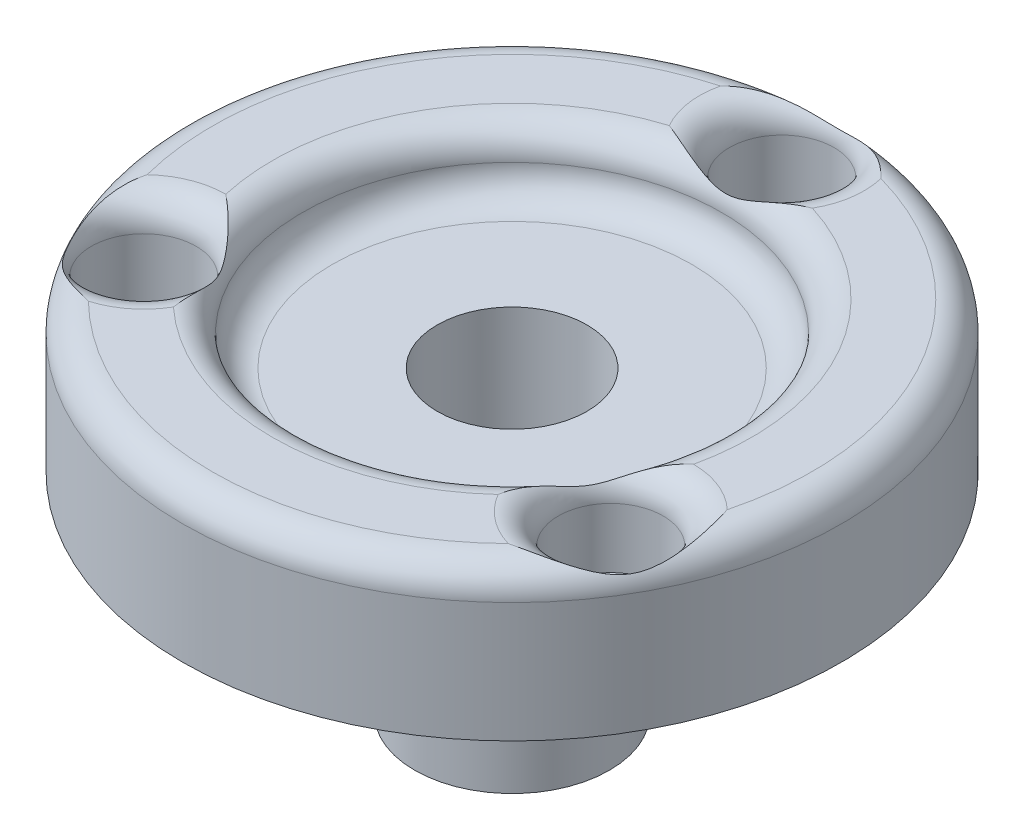
ISO-10303-21;
HEADER;
FILE_DESCRIPTION(('STEP AP214'),'2;1');
FILE_NAME('part.step','',(''),(''),'','','');
FILE_SCHEMA(('AUTOMOTIVE_DESIGN { 1 0 10303 214 1 1 1 1 }'));
ENDSEC;
DATA;
#1=APPLICATION_CONTEXT('core data for automotive mechanical design processes');
#2=APPLICATION_PROTOCOL_DEFINITION('international standard','automotive_design',2000,#1);
#3=PRODUCT_CONTEXT('',#1,'mechanical');
#4=PRODUCT('Part','Part','',(#3));
#5=PRODUCT_RELATED_PRODUCT_CATEGORY('part','',(#4));
#6=PRODUCT_DEFINITION_FORMATION('','',#4);
#7=PRODUCT_DEFINITION_CONTEXT('part definition',#1,'design');
#8=PRODUCT_DEFINITION('design','',#6,#7);
#9=PRODUCT_DEFINITION_SHAPE('','',#8);
#10=(LENGTH_UNIT() NAMED_UNIT(*) SI_UNIT(.MILLI.,.METRE.));
#11=(NAMED_UNIT(*) PLANE_ANGLE_UNIT() SI_UNIT($,.RADIAN.));
#12=(NAMED_UNIT(*) SI_UNIT($,.STERADIAN.) SOLID_ANGLE_UNIT());
#13=UNCERTAINTY_MEASURE_WITH_UNIT(LENGTH_MEASURE(1.E-05),#10,'distance_accuracy_value','');
#14=(GEOMETRIC_REPRESENTATION_CONTEXT(3) GLOBAL_UNCERTAINTY_ASSIGNED_CONTEXT((#13)) GLOBAL_UNIT_ASSIGNED_CONTEXT((#10,
#11,#12)) REPRESENTATION_CONTEXT('',''));
#15=CARTESIAN_POINT('',(0.,0.,0.));
#16=DIRECTION('',(0.,0.,1.));
#17=DIRECTION('',(1.,0.,0.));
#18=AXIS2_PLACEMENT_3D('',#15,#16,#17);
#19=CARTESIAN_POINT('',(0.,5.,0.));
#20=DIRECTION('',(0.,1.,0.));
#21=DIRECTION('',(0.,0.,1.));
#22=AXIS2_PLACEMENT_3D('',#19,#20,#21);
#23=PLANE('',#22);
#24=CARTESIAN_POINT('',(0.,5.,-9.));
#25=DIRECTION('',(0.,1.,0.));
#26=DIRECTION('',(0.,0.,1.));
#27=AXIS2_PLACEMENT_3D('',#24,#25,#26);
#28=CIRCLE('',#27,2.75);
#29=CARTESIAN_POINT('',(-2.38755362796082,5.,-7.63541666666667));
#30=VERTEX_POINT('',#29);
#31=CARTESIAN_POINT('',(-2.67558323730028,5.,-9.63541666666666));
#32=VERTEX_POINT('',#31);
#33=EDGE_CURVE('E53',#30,#32,#28,.F.);
#34=ORIENTED_EDGE('',*,*,#33,.T.);
#35=CARTESIAN_POINT('',(0.,5.,0.));
#36=DIRECTION('',(0.,1.,0.));
#37=DIRECTION('',(0.,0.,1.));
#38=AXIS2_PLACEMENT_3D('',#35,#36,#37);
#39=CIRCLE('',#38,10.);
#40=CARTESIAN_POINT('',(-9.68230722803127,5.,2.50058527989216));
#41=VERTEX_POINT('',#40);
#42=EDGE_CURVE('E141',#32,#41,#39,.T.);
#43=ORIENTED_EDGE('',*,*,#42,.T.);
#44=CARTESIAN_POINT('',(-7.7942286340594,5.,4.50000000000032));
#45=DIRECTION('',(0.,1.,0.));
#46=DIRECTION('',(0.,0.,1.));
#47=AXIS2_PLACEMENT_3D('',#44,#45,#46);
#48=CIRCLE('',#47,2.75);
#49=CARTESIAN_POINT('',(-7.80624161579277,5.,1.75002623862188));
#50=VERTEX_POINT('',#49);
#51=EDGE_CURVE('E61',#41,#50,#48,.F.);
#52=ORIENTED_EDGE('',*,*,#51,.T.);
#53=CARTESIAN_POINT('',(0.,5.,0.));
#54=DIRECTION('',(0.,1.,0.));
#55=DIRECTION('',(0.,0.,1.));
#56=AXIS2_PLACEMENT_3D('',#53,#54,#55);
#57=CIRCLE('',#56,8.);
#58=EDGE_CURVE('E137',#50,#30,#57,.F.);
#59=ORIENTED_EDGE('',*,*,#58,.T.);
#60=EDGE_LOOP('',(#34,#43,#52,#59));
#61=FACE_BOUND('',#60,.T.);
#62=ADVANCED_FACE('F32',(#61),#23,.T.);
#63=CARTESIAN_POINT('',(7.79422863406049,5.,4.49999999999969));
#64=DIRECTION('',(0.,1.,0.));
#65=DIRECTION('',(0.,0.,1.));
#66=AXIS2_PLACEMENT_3D('',#63,#64,#65);
#67=CIRCLE('',#66,2.75);
#68=CARTESIAN_POINT('',(7.80624161579291,5.,1.75002623862124));
#69=VERTEX_POINT('',#68);
#70=CARTESIAN_POINT('',(9.68230722803162,5.,2.50058527989082));
#71=VERTEX_POINT('',#70);
#72=EDGE_CURVE('E109',#69,#71,#67,.F.);
#73=ORIENTED_EDGE('',*,*,#72,.T.);
#74=CARTESIAN_POINT('',(0.,5.,0.));
#75=DIRECTION('',(0.,1.,0.));
#76=DIRECTION('',(0.,0.,1.));
#77=AXIS2_PLACEMENT_3D('',#74,#75,#76);
#78=CIRCLE('',#77,10.);
#79=CARTESIAN_POINT('',(2.67558323730028,5.,-9.63541666666666));
#80=VERTEX_POINT('',#79);
#81=EDGE_CURVE('E134',#71,#80,#78,.T.);
#82=ORIENTED_EDGE('',*,*,#81,.T.);
#83=CARTESIAN_POINT('',(0.,5.,-9.));
#84=DIRECTION('',(0.,1.,0.));
#85=DIRECTION('',(0.,0.,1.));
#86=AXIS2_PLACEMENT_3D('',#83,#84,#85);
#87=CIRCLE('',#86,2.75);
#88=CARTESIAN_POINT('',(2.38755362796082,5.,-7.63541666666667));
#89=VERTEX_POINT('',#88);
#90=EDGE_CURVE('E132',#80,#89,#87,.F.);
#91=ORIENTED_EDGE('',*,*,#90,.T.);
#92=CARTESIAN_POINT('',(0.,5.,0.));
#93=DIRECTION('',(0.,1.,0.));
#94=DIRECTION('',(0.,0.,1.));
#95=AXIS2_PLACEMENT_3D('',#92,#93,#94);
#96=CIRCLE('',#95,8.);
#97=EDGE_CURVE('E129',#89,#69,#96,.F.);
#98=ORIENTED_EDGE('',*,*,#97,.T.);
#99=EDGE_LOOP('',(#73,#82,#91,#98));
#100=FACE_BOUND('',#99,.T.);
#101=ADVANCED_FACE('F209',(#100),#23,.T.);
#102=CARTESIAN_POINT('',(0.,5.,0.));
#103=DIRECTION('',(0.,-1.,0.));
#104=DIRECTION('',(0.,0.,-1.));
#105=AXIS2_PLACEMENT_3D('',#102,#103,#104);
#106=CYLINDRICAL_SURFACE('',#105,11.);
#107=CARTESIAN_POINT('',(0.,4.,0.));
#108=DIRECTION('',(0.,1.,0.));
#109=DIRECTION('',(0.,0.,1.));
#110=AXIS2_PLACEMENT_3D('',#107,#108,#109);
#111=CIRCLE('',#110,11.);
#112=CARTESIAN_POINT('',(0.,4.,11.));
#113=VERTEX_POINT('',#112);
#114=EDGE_CURVE('E143',#113,#113,#111,.F.);
#115=ORIENTED_EDGE('',*,*,#114,.T.);
#116=EDGE_LOOP('',(#115));
#117=FACE_BOUND('',#116,.T.);
#118=CARTESIAN_POINT('',(0.,0.,0.));
#119=DIRECTION('',(0.,1.,0.));
#120=DIRECTION('',(0.,0.,1.));
#121=AXIS2_PLACEMENT_3D('',#118,#119,#120);
#122=CIRCLE('',#121,11.);
#123=CARTESIAN_POINT('',(0.,0.,11.));
#124=VERTEX_POINT('',#123);
#125=EDGE_CURVE('E234',#124,#124,#122,.T.);
#126=ORIENTED_EDGE('',*,*,#125,.T.);
#127=EDGE_LOOP('',(#126));
#128=FACE_BOUND('',#127,.T.);
#129=ADVANCED_FACE('F214',(#117,#128),#106,.T.);
#130=CARTESIAN_POINT('',(-7.7942286340594,5.,4.50000000000032));
#131=DIRECTION('',(0.,1.,0.));
#132=DIRECTION('',(0.,0.,1.));
#133=AXIS2_PLACEMENT_3D('',#130,#131,#132);
#134=CIRCLE('',#133,2.75);
#135=CARTESIAN_POINT('',(-5.41868798783155,5.,5.88539042804554));
#136=VERTEX_POINT('',#135);
#137=CARTESIAN_POINT('',(-7.0067239907308,5.,7.13483138677554));
#138=VERTEX_POINT('',#137);
#139=EDGE_CURVE('E103',#136,#138,#134,.F.);
#140=ORIENTED_EDGE('',*,*,#139,.T.);
#141=CARTESIAN_POINT('',(0.,5.,0.));
#142=DIRECTION('',(0.,1.,0.));
#143=DIRECTION('',(0.,0.,1.));
#144=AXIS2_PLACEMENT_3D('',#141,#142,#143);
#145=CIRCLE('',#144,10.);
#146=CARTESIAN_POINT('',(7.00672399073154,5.,7.13483138677481));
#147=VERTEX_POINT('',#146);
#148=EDGE_CURVE('E99',#138,#147,#145,.T.);
#149=ORIENTED_EDGE('',*,*,#148,.T.);
#150=CARTESIAN_POINT('',(7.79422863406049,5.,4.49999999999969));
#151=DIRECTION('',(0.,1.,0.));
#152=DIRECTION('',(0.,0.,1.));
#153=AXIS2_PLACEMENT_3D('',#150,#151,#152);
#154=CIRCLE('',#153,2.75);
#155=CARTESIAN_POINT('',(5.41868798783249,5.,5.88539042804467));
#156=VERTEX_POINT('',#155);
#157=EDGE_CURVE('E92',#147,#156,#154,.F.);
#158=ORIENTED_EDGE('',*,*,#157,.T.);
#159=CARTESIAN_POINT('',(0.,5.,0.));
#160=DIRECTION('',(0.,1.,0.));
#161=DIRECTION('',(0.,0.,1.));
#162=AXIS2_PLACEMENT_3D('',#159,#160,#161);
#163=CIRCLE('',#162,8.);
#164=EDGE_CURVE('E96',#156,#136,#163,.F.);
#165=ORIENTED_EDGE('',*,*,#164,.T.);
#166=EDGE_LOOP('',(#140,#149,#158,#165));
#167=FACE_BOUND('',#166,.T.);
#168=ADVANCED_FACE('F94',(#167),#23,.T.);
#169=CARTESIAN_POINT('',(0.,0.,0.));
#170=DIRECTION('',(0.,1.,0.));
#171=DIRECTION('',(0.,0.,1.));
#172=AXIS2_PLACEMENT_3D('',#169,#170,#171);
#173=PLANE('',#172);
#174=CARTESIAN_POINT('',(0.,0.,0.));
#175=DIRECTION('',(0.,1.,0.));
#176=DIRECTION('',(0.,0.,1.));
#177=AXIS2_PLACEMENT_3D('',#174,#175,#176);
#178=CIRCLE('',#177,3.25);
#179=CARTESIAN_POINT('',(0.,0.,3.25));
#180=VERTEX_POINT('',#179);
#181=EDGE_CURVE('E124',#180,#180,#178,.F.);
#182=ORIENTED_EDGE('',*,*,#181,.F.);
#183=EDGE_LOOP('',(#182));
#184=FACE_BOUND('',#183,.T.);
#185=ORIENTED_EDGE('',*,*,#125,.F.);
#186=EDGE_LOOP('',(#185));
#187=FACE_BOUND('',#186,.T.);
#188=ADVANCED_FACE('F219',(#184,#187),#173,.F.);
#189=CARTESIAN_POINT('',(0.,2.,-9.));
#190=DIRECTION('',(0.,1.,0.));
#191=DIRECTION('',(0.,0.,1.));
#192=AXIS2_PLACEMENT_3D('',#189,#190,#191);
#193=CYLINDRICAL_SURFACE('',#192,1.75);
#194=CARTESIAN_POINT('',(0.,4.,-9.));
#195=DIRECTION('',(0.,1.,0.));
#196=DIRECTION('',(0.,0.,1.));
#197=AXIS2_PLACEMENT_3D('',#194,#195,#196);
#198=CIRCLE('',#197,1.75);
#199=CARTESIAN_POINT('',(0.,4.,-7.25));
#200=VERTEX_POINT('',#199);
#201=EDGE_CURVE('E146',#200,#200,#198,.T.);
#202=ORIENTED_EDGE('',*,*,#201,.T.);
#203=EDGE_LOOP('',(#202));
#204=FACE_BOUND('',#203,.T.);
#205=CARTESIAN_POINT('',(0.,2.,-9.));
#206=DIRECTION('',(0.,1.,0.));
#207=DIRECTION('',(0.,0.,1.));
#208=AXIS2_PLACEMENT_3D('',#205,#206,#207);
#209=CIRCLE('',#208,1.75);
#210=CARTESIAN_POINT('',(0.,2.,-7.25));
#211=VERTEX_POINT('',#210);
#212=EDGE_CURVE('E236',#211,#211,#209,.T.);
#213=ORIENTED_EDGE('',*,*,#212,.F.);
#214=EDGE_LOOP('',(#213));
#215=FACE_BOUND('',#214,.T.);
#216=ADVANCED_FACE('F224',(#204,#215),#193,.F.);
#217=CARTESIAN_POINT('',(0.,2.,-9.));
#218=DIRECTION('',(0.,1.,0.));
#219=DIRECTION('',(0.,0.,1.));
#220=AXIS2_PLACEMENT_3D('',#217,#218,#219);
#221=PLANE('',#220);
#222=ORIENTED_EDGE('',*,*,#212,.T.);
#223=EDGE_LOOP('',(#222));
#224=FACE_BOUND('',#223,.T.);
#225=ADVANCED_FACE('F296',(#224),#221,.T.);
#226=CARTESIAN_POINT('',(7.79422863406049,2.,4.49999999999969));
#227=DIRECTION('',(0.,1.,0.));
#228=DIRECTION('',(0.,0.,1.));
#229=AXIS2_PLACEMENT_3D('',#226,#227,#228);
#230=CYLINDRICAL_SURFACE('',#229,1.75);
#231=CARTESIAN_POINT('',(7.79422863406049,4.,4.49999999999969));
#232=DIRECTION('',(0.,1.,0.));
#233=DIRECTION('',(0.,0.,1.));
#234=AXIS2_PLACEMENT_3D('',#231,#232,#233);
#235=CIRCLE('',#234,1.75);
#236=CARTESIAN_POINT('',(7.79422863406049,4.,6.24999999999969));
#237=VERTEX_POINT('',#236);
#238=EDGE_CURVE('E45',#237,#237,#235,.T.);
#239=ORIENTED_EDGE('',*,*,#238,.T.);
#240=EDGE_LOOP('',(#239));
#241=FACE_BOUND('',#240,.T.);
#242=CARTESIAN_POINT('',(7.79422863406049,2.,4.49999999999969));
#243=DIRECTION('',(0.,1.,0.));
#244=DIRECTION('',(0.,0.,1.));
#245=AXIS2_PLACEMENT_3D('',#242,#243,#244);
#246=CIRCLE('',#245,1.75);
#247=CARTESIAN_POINT('',(7.79422863406049,2.,6.24999999999969));
#248=VERTEX_POINT('',#247);
#249=EDGE_CURVE('E240',#248,#248,#246,.T.);
#250=ORIENTED_EDGE('',*,*,#249,.F.);
#251=EDGE_LOOP('',(#250));
#252=FACE_BOUND('',#251,.T.);
#253=ADVANCED_FACE('F292',(#241,#252),#230,.F.);
#254=CARTESIAN_POINT('',(7.79422863406049,2.,4.49999999999969));
#255=DIRECTION('',(0.,1.,0.));
#256=DIRECTION('',(0.,0.,1.));
#257=AXIS2_PLACEMENT_3D('',#254,#255,#256);
#258=PLANE('',#257);
#259=ORIENTED_EDGE('',*,*,#249,.T.);
#260=EDGE_LOOP('',(#259));
#261=FACE_BOUND('',#260,.T.);
#262=ADVANCED_FACE('F275',(#261),#258,.T.);
#263=CARTESIAN_POINT('',(-7.7942286340594,2.,4.50000000000032));
#264=DIRECTION('',(0.,1.,0.));
#265=DIRECTION('',(0.,0.,1.));
#266=AXIS2_PLACEMENT_3D('',#263,#264,#265);
#267=CYLINDRICAL_SURFACE('',#266,1.75);
#268=CARTESIAN_POINT('',(-7.7942286340594,4.,4.50000000000032));
#269=DIRECTION('',(0.,1.,0.));
#270=DIRECTION('',(0.,0.,1.));
#271=AXIS2_PLACEMENT_3D('',#268,#269,#270);
#272=CIRCLE('',#271,1.75);
#273=CARTESIAN_POINT('',(-7.7942286340594,4.,6.25000000000032));
#274=VERTEX_POINT('',#273);
#275=EDGE_CURVE('E11',#274,#274,#272,.T.);
#276=ORIENTED_EDGE('',*,*,#275,.T.);
#277=EDGE_LOOP('',(#276));
#278=FACE_BOUND('',#277,.T.);
#279=CARTESIAN_POINT('',(-7.7942286340594,2.,4.50000000000032));
#280=DIRECTION('',(0.,1.,0.));
#281=DIRECTION('',(0.,0.,1.));
#282=AXIS2_PLACEMENT_3D('',#279,#280,#281);
#283=CIRCLE('',#282,1.75);
#284=CARTESIAN_POINT('',(-7.7942286340594,2.,6.25000000000032));
#285=VERTEX_POINT('',#284);
#286=EDGE_CURVE('E245',#285,#285,#283,.T.);
#287=ORIENTED_EDGE('',*,*,#286,.F.);
#288=EDGE_LOOP('',(#287));
#289=FACE_BOUND('',#288,.T.);
#290=ADVANCED_FACE('F271',(#278,#289),#267,.F.);
#291=CARTESIAN_POINT('',(-7.7942286340594,2.,4.50000000000032));
#292=DIRECTION('',(0.,1.,0.));
#293=DIRECTION('',(0.,0.,1.));
#294=AXIS2_PLACEMENT_3D('',#291,#292,#293);
#295=PLANE('',#294);
#296=ORIENTED_EDGE('',*,*,#286,.T.);
#297=EDGE_LOOP('',(#296));
#298=FACE_BOUND('',#297,.T.);
#299=ADVANCED_FACE('F274',(#298),#295,.T.);
#300=CARTESIAN_POINT('',(0.,3.,0.));
#301=DIRECTION('',(0.,1.,0.));
#302=DIRECTION('',(0.,0.,1.));
#303=AXIS2_PLACEMENT_3D('',#300,#301,#302);
#304=PLANE('',#303);
#305=CARTESIAN_POINT('',(0.,3.,0.));
#306=DIRECTION('',(0.,1.,0.));
#307=DIRECTION('',(0.,0.,1.));
#308=AXIS2_PLACEMENT_3D('',#305,#306,#307);
#309=CIRCLE('',#308,6.);
#310=CARTESIAN_POINT('',(0.,3.,6.));
#311=VERTEX_POINT('',#310);
#312=EDGE_CURVE('E120',#311,#311,#309,.T.);
#313=ORIENTED_EDGE('',*,*,#312,.T.);
#314=EDGE_LOOP('',(#313));
#315=FACE_BOUND('',#314,.T.);
#316=CARTESIAN_POINT('',(0.,3.,0.));
#317=DIRECTION('',(0.,1.,0.));
#318=DIRECTION('',(0.,0.,1.));
#319=AXIS2_PLACEMENT_3D('',#316,#317,#318);
#320=CIRCLE('',#319,2.5);
#321=CARTESIAN_POINT('',(0.,3.,2.5));
#322=VERTEX_POINT('',#321);
#323=EDGE_CURVE('E251',#322,#322,#320,.T.);
#324=ORIENTED_EDGE('',*,*,#323,.F.);
#325=EDGE_LOOP('',(#324));
#326=FACE_BOUND('',#325,.T.);
#327=ADVANCED_FACE('F280',(#315,#326),#304,.T.);
#328=CARTESIAN_POINT('',(0.,-7.,0.));
#329=DIRECTION('',(0.,1.,0.));
#330=DIRECTION('',(0.,0.,1.));
#331=AXIS2_PLACEMENT_3D('',#328,#329,#330);
#332=CYLINDRICAL_SURFACE('',#331,3.25);
#333=CARTESIAN_POINT('',(0.,-7.,0.));
#334=DIRECTION('',(0.,-1.,0.));
#335=DIRECTION('',(0.,0.,-1.));
#336=AXIS2_PLACEMENT_3D('',#333,#334,#335);
#337=CIRCLE('',#336,3.25);
#338=CARTESIAN_POINT('',(0.,-7.,-3.25));
#339=VERTEX_POINT('',#338);
#340=EDGE_CURVE('E248',#339,#339,#337,.T.);
#341=ORIENTED_EDGE('',*,*,#340,.F.);
#342=EDGE_LOOP('',(#341));
#343=FACE_BOUND('',#342,.T.);
#344=ORIENTED_EDGE('',*,*,#181,.T.);
#345=EDGE_LOOP('',(#344));
#346=FACE_BOUND('',#345,.T.);
#347=ADVANCED_FACE('F285',(#343,#346),#332,.T.);
#348=CARTESIAN_POINT('',(0.,-7.,0.));
#349=DIRECTION('',(0.,-1.,0.));
#350=DIRECTION('',(0.,0.,-1.));
#351=AXIS2_PLACEMENT_3D('',#348,#349,#350);
#352=PLANE('',#351);
#353=CARTESIAN_POINT('',(0.,-7.,0.));
#354=DIRECTION('',(0.,-1.,0.));
#355=DIRECTION('',(0.,0.,-1.));
#356=AXIS2_PLACEMENT_3D('',#353,#354,#355);
#357=CIRCLE('',#356,2.5);
#358=CARTESIAN_POINT('',(0.,-7.,-2.5));
#359=VERTEX_POINT('',#358);
#360=EDGE_CURVE('E254',#359,#359,#357,.T.);
#361=ORIENTED_EDGE('',*,*,#360,.F.);
#362=EDGE_LOOP('',(#361));
#363=FACE_BOUND('',#362,.T.);
#364=ORIENTED_EDGE('',*,*,#340,.T.);
#365=EDGE_LOOP('',(#364));
#366=FACE_BOUND('',#365,.T.);
#367=ADVANCED_FACE('F375',(#363,#366),#352,.T.);
#368=CARTESIAN_POINT('',(0.,8.00000000000001,0.));
#369=DIRECTION('',(0.,-1.,0.));
#370=DIRECTION('',(0.,0.,-1.));
#371=AXIS2_PLACEMENT_3D('',#368,#369,#370);
#372=CYLINDRICAL_SURFACE('',#371,2.5);
#373=ORIENTED_EDGE('',*,*,#323,.T.);
#374=EDGE_LOOP('',(#373));
#375=FACE_BOUND('',#374,.T.);
#376=ORIENTED_EDGE('',*,*,#360,.T.);
#377=EDGE_LOOP('',(#376));
#378=FACE_BOUND('',#377,.T.);
#379=ADVANCED_FACE('F198',(#375,#378),#372,.F.);
#380=CARTESIAN_POINT('',(0.,4.,0.));
#381=DIRECTION('',(0.,1.,0.));
#382=DIRECTION('',(0.,0.,1.));
#383=AXIS2_PLACEMENT_3D('',#380,#381,#382);
#384=TOROIDAL_SURFACE('',#383,10.,1.);
#385=ORIENTED_EDGE('',*,*,#114,.F.);
#386=EDGE_LOOP('',(#385));
#387=FACE_BOUND('',#386,.T.);
#388=CARTESIAN_POINT('',(9.68230722803162,5.,2.50058527989082));
#389=CARTESIAN_POINT('',(9.68293122787984,4.99999999289287,2.50275001462165));
#390=CARTESIAN_POINT('',(9.68355376892448,4.99999802492857,2.50491521072469));
#391=CARTESIAN_POINT('',(9.73072449026111,4.99970014995168,2.66939566220376));
#392=CARTESIAN_POINT('',(9.76906282956554,4.98842946601575,2.83427567242256));
#393=CARTESIAN_POINT('',(9.82691492459715,4.94961759514946,3.16564958110249));
#394=CARTESIAN_POINT('',(9.84637618519727,4.92203137699082,3.33214668701702));
#395=CARTESIAN_POINT('',(9.86086509575913,4.87022438303142,3.59198018961696));
#396=CARTESIAN_POINT('',(9.86282800378811,4.84973008915019,3.68573861128274));
#397=CARTESIAN_POINT('',(9.85998319877821,4.80624814568228,3.87256726988606));
#398=CARTESIAN_POINT('',(9.85517662806238,4.78326091737264,3.96563762026901));
#399=CARTESIAN_POINT('',(9.83855309177433,4.7359616859256,4.15096011536726));
#400=CARTESIAN_POINT('',(9.82672520332001,4.71164767237435,4.24321075744506));
#401=CARTESIAN_POINT('',(9.79578730916428,4.66326714790835,4.42654054580411));
#402=CARTESIAN_POINT('',(9.7766794564654,4.63920056597634,4.51762003022296));
#403=CARTESIAN_POINT('',(9.73785568135397,4.60045136777176,4.67080509067776));
#404=CARTESIAN_POINT('',(9.72011151517862,4.58514923887297,4.73325596661643));
#405=CARTESIAN_POINT('',(9.68081782794899,4.55665426519299,4.85745288522944));
#406=CARTESIAN_POINT('',(9.65926847535845,4.54346132708266,4.9191989589781));
#407=CARTESIAN_POINT('',(9.61240260496447,4.52039826493819,5.04142216705938));
#408=CARTESIAN_POINT('',(9.58711165760926,4.51050696504576,5.10190496058564));
#409=CARTESIAN_POINT('',(9.53264209619287,4.49508953132335,5.22166495320231));
#410=CARTESIAN_POINT('',(9.50346489818042,4.48956181257556,5.2809425823978));
#411=CARTESIAN_POINT('',(9.44103706289631,4.48365691539091,5.3983956537084));
#412=CARTESIAN_POINT('',(9.40774699431049,4.48333423991811,5.45655307082596));
#413=CARTESIAN_POINT('',(9.33768982707241,4.4880290601587,5.57050060971875));
#414=CARTESIAN_POINT('',(9.30092212605365,4.4930474825616,5.626290318946));
#415=CARTESIAN_POINT('',(9.18555912241717,4.51505927391676,5.79005170093081));
#416=CARTESIAN_POINT('',(9.10224604433231,4.53902925363097,5.89377621987413));
#417=CARTESIAN_POINT('',(8.94794224781334,4.58862424758896,6.06417769814614));
#418=CARTESIAN_POINT('',(8.87918028624801,4.61228999691721,6.13358137559057));
#419=CARTESIAN_POINT('',(8.73630228054981,4.66144298052247,6.26602776867833));
#420=CARTESIAN_POINT('',(8.66218403095377,4.68693096506204,6.32906783819004));
#421=CARTESIAN_POINT('',(8.50895450417988,4.73755067310296,6.44894722488114));
#422=CARTESIAN_POINT('',(8.42984166455751,4.76268228207918,6.50578458635926));
#423=CARTESIAN_POINT('',(8.26700105249125,4.81098564005148,6.61336904450495));
#424=CARTESIAN_POINT('',(8.18327220656441,4.83415692995976,6.66411471571679));
#425=CARTESIAN_POINT('',(7.92964914433914,4.89780722023445,6.80513020164878));
#426=CARTESIAN_POINT('',(7.75375661243947,4.93370903723956,6.88692122403518));
#427=CARTESIAN_POINT('',(7.39047441957718,4.98459180645575,7.02724829376745));
#428=CARTESIAN_POINT('',(7.20313219797398,4.99965368403904,7.08587366005666));
#429=CARTESIAN_POINT('',(7.01109708834323,4.99999802273882,7.13374596127582));
#430=CARTESIAN_POINT('',(7.00891070301672,4.99999999066669,7.13428942293817));
#431=CARTESIAN_POINT('',(7.00672399073154,5.,7.13483138677481));
#432=B_SPLINE_CURVE_WITH_KNOTS('',3,(#388,#389,#390,#391,#392,#393,#394,#395,#396,#397,#398,
#399,#400,#401,#402,#403,#404,#405,#406,#407,#408,#409,#410,#411,#412,#413,#414,#415,#416,#417,
#418,#419,#420,#421,#422,#423,#424,#425,#426,#427,#428,#429,#430,#431),.UNSPECIFIED.,.F.,.F.,(4,
2,2,2,2,2,2,2,2,2,2,2,2,2,2,2,2,2,2,2,2,4),(0.,0.00675874589591421,0.513324019385968,
1.02129399180734,1.30902593812217,1.596709336614,1.88484145390252,2.17288842403652,
2.37287491434796,2.57285255304894,2.77152177064788,2.97011879537665,3.17079403180504,
3.37150409140344,3.77506342056821,4.07633949291594,4.37774033101154,4.67923592727949,
4.98080193656975,5.57006390783273,6.15703118128854,6.16378992722158),.UNSPECIFIED.);
#433=EDGE_CURVE('E184',#147,#71,#432,.F.);
#434=ORIENTED_EDGE('',*,*,#433,.F.);
#435=ORIENTED_EDGE('',*,*,#148,.F.);
#436=CARTESIAN_POINT('',(-7.00672399073079,5.,7.13483138677555));
#437=CARTESIAN_POINT('',(-7.00891070592425,4.99999999289287,7.13428941913064));
#438=CARTESIAN_POINT('',(-7.01109709127598,4.99999802492857,7.13374595743867));
#439=CARTESIAN_POINT('',(-7.17712670135101,4.99970014995168,7.09235677469053));
#440=CARTESIAN_POINT('',(-7.33908614842924,4.98842946601574,7.04311874535829));
#441=CARTESIAN_POINT('',(-7.65499041901351,4.94961759514942,6.92753317497818));
#442=CARTESIAN_POINT('',(-7.80891177269214,4.92203137699076,6.86113856809003));
#443=CARTESIAN_POINT('',(-8.04117864197772,4.87022438303161,6.74376958141022));
#444=CARTESIAN_POINT('',(-8.12335727097236,4.84973008915071,6.69859029879639));
#445=CARTESIAN_POINT('',(-8.28373323297065,4.80624814568351,6.60271229608883));
#446=CARTESIAN_POINT('',(-8.36193123538245,4.78326091737425,6.55201450855318));
#447=CARTESIAN_POINT('',(-8.51411345588429,4.73596168592799,6.44495685627965));
#448=CARTESIAN_POINT('',(-8.58809091121104,4.71164767237713,6.38858828336713));
#449=CARTESIAN_POINT('',(-8.73139021812091,4.66326714791181,6.27013038691123));
#450=CARTESIAN_POINT('',(-8.80071343904105,4.63920056598012,6.20804275885393));
#451=CARTESIAN_POINT('',(-8.91396370531919,4.6004513677756,6.09782785311041));
#452=CARTESIAN_POINT('',(-8.95917566728339,4.58514923887664,6.05123551646423));
#453=CARTESIAN_POINT('',(-9.04708651026,4.55665426519625,5.95510772580843));
#454=CARTESIAN_POINT('',(-9.08978550241541,4.5434613270857,5.90557240215554));
#455=CARTESIAN_POINT('',(-9.1722009703496,4.52039826494071,5.80387376378312));
#456=CARTESIAN_POINT('',(-9.21193513235797,4.510506965048,5.75172976412452));
#457=CARTESIAN_POINT('',(-9.28841554761359,4.49508953132502,5.64467774389641));
#458=CARTESIAN_POINT('',(-9.32516288136714,4.48956181257692,5.58977073460851));
#459=CARTESIAN_POINT('',(-9.39566630723332,4.48365691539166,5.47698010769358));
#460=CARTESIAN_POINT('',(-9.42938707358308,4.48333423991858,5.41907135404555));
#461=CARTESIAN_POINT('',(-9.49303995334464,4.48802906015865,5.30142629805334));
#462=CARTESIAN_POINT('',(-9.52297140829615,4.49304748256133,5.24168968031846));
#463=CARTESIAN_POINT('',(-9.6071114234366,4.51505927391597,5.05990169751917));
#464=CARTESIAN_POINT('',(-9.65528295279499,4.53902925363001,4.93588819595792));
#465=CARTESIAN_POINT('',(-9.7257030635621,4.58862424758777,4.71705644913575));
#466=CARTESIAN_POINT('',(-9.75142743056251,4.61228999691585,4.62280500488419));
#467=CARTESIAN_POINT('',(-9.79469036876734,4.66144298052083,4.43284582576418));
#468=CARTESIAN_POINT('',(-9.81222554562296,4.6869309650603,4.3371375039744));
#469=CARTESIAN_POINT('',(-9.83942937650098,4.73755067310104,4.14449714783338));
#470=CARTESIAN_POINT('',(-9.84909555561413,4.76268228207722,4.04756473821611));
#471=CARTESIAN_POINT('',(-9.86084612338799,4.81098564004946,3.85274840232665));
#472=CARTESIAN_POINT('',(-9.86292874082635,4.83415692995774,3.75486425911882));
#473=CARTESIAN_POINT('',(-9.85824020285855,4.89780722023299,3.46471250127889));
#474=CARTESIAN_POINT('',(-9.84112704009709,4.93370903723862,3.27148958912302));
#475=CARTESIAN_POINT('',(-9.78101275089261,4.98459180645548,2.88671444649248));
#476=CARTESIAN_POINT('',(-9.73811269660326,4.99965368403891,2.69515864023653));
#477=CARTESIAN_POINT('',(-9.68355377078107,4.99999802273883,2.5049152062666));
#478=CARTESIAN_POINT('',(-9.6829312297234,4.99999999066669,2.50275001020021));
#479=CARTESIAN_POINT('',(-9.68230722803127,5.,2.50058527989215));
#480=B_SPLINE_CURVE_WITH_KNOTS('',3,(#436,#437,#438,#439,#440,#441,#442,#443,#444,#445,#446,
#447,#448,#449,#450,#451,#452,#453,#454,#455,#456,#457,#458,#459,#460,#461,#462,#463,#464,#465,
#466,#467,#468,#469,#470,#471,#472,#473,#474,#475,#476,#477,#478,#479),.UNSPECIFIED.,.F.,.F.,(4,
2,2,2,2,2,2,2,2,2,2,2,2,2,2,2,2,2,2,2,2,4),(0.,0.00675874589591401,0.513324019386391,
1.02129399180799,1.30902593811871,1.59670933660643,1.88484145389093,2.17288842402094,
2.37287491433338,2.57285255303535,2.77152177063527,2.97011879536503,3.17079403179452,
3.37150409139402,3.77506342056098,4.0763394929079,4.37774033100269,4.67923592726982,
4.98080193655927,5.57006390782702,6.15703118128763,6.16378992722067),.UNSPECIFIED.);
#481=EDGE_CURVE('E36',#41,#138,#480,.F.);
#482=ORIENTED_EDGE('',*,*,#481,.F.);
#483=ORIENTED_EDGE('',*,*,#42,.F.);
#484=CARTESIAN_POINT('',(-2.67558323730028,5.,-9.63541666666667));
#485=CARTESIAN_POINT('',(-2.67402052195504,4.99999999289287,-9.6370394337526));
#486=CARTESIAN_POINT('',(-2.67245667764795,4.99999802492857,-9.63866116816368));
#487=CARTESIAN_POINT('',(-2.55359778890952,4.99970014995165,-9.7617524368956));
#488=CARTESIAN_POINT('',(-2.42997668113597,4.98842946601575,-9.87739441778147));
#489=CARTESIAN_POINT('',(-2.17192450558357,4.94961759514949,-10.0931827560809));
#490=CARTESIAN_POINT('',(-2.03746441250507,4.92203137699086,-10.1932852551075));
#491=CARTESIAN_POINT('',(-1.81968645377999,4.87022438303143,-10.3357497710273));
#492=CARTESIAN_POINT('',(-1.73947073281299,4.84973008915017,-10.3843289100787));
#493=CARTESIAN_POINT('',(-1.57624996580222,4.80624814568216,-10.4752795659731));
#494=CARTESIAN_POINT('',(-1.49324539267336,4.78326091737247,-10.5176521288196));
#495=CARTESIAN_POINT('',(-1.32443963588114,4.73596168592534,-10.5959169716427));
#496=CARTESIAN_POINT('',(-1.23863429209897,4.71164767237405,-10.631799040807));
#497=CARTESIAN_POINT('',(-1.06439709103132,4.66326714790797,-10.6966709327081));
#498=CARTESIAN_POINT('',(-0.975966017411357,4.63920056597592,-10.7256627890686));
#499=CARTESIAN_POINT('',(-0.823891976021313,4.60045136777136,-10.7686329437786));
#500=CARTESIAN_POINT('',(-0.760935847882168,4.58514923887261,-10.784491483071));
#501=CARTESIAN_POINT('',(-0.633731317676748,4.55665426519271,-10.8125606110282));
#502=CARTESIAN_POINT('',(-0.569482972931197,4.54346132708244,-10.824771361124));
#503=CARTESIAN_POINT('',(-0.440201634603807,4.52039826493806,-10.8452959308328));
#504=CARTESIAN_POINT('',(-0.375176525240617,4.51050696504569,-10.8536347247005));
#505=CARTESIAN_POINT('',(-0.244226548569384,4.49508953132341,-10.8663426970892));
#506=CARTESIAN_POINT('',(-0.17830201680377,4.48956181257568,-10.8707133169968));
#507=CARTESIAN_POINT('',(-0.0453707556542837,4.48365691539115,-10.8753757613927));
#508=CARTESIAN_POINT('',(0.0216400792808803,4.48333423991842,-10.8756244248624));
#509=CARTESIAN_POINT('',(0.155350126279708,4.48802906015911,-10.8719269077633));
#510=CARTESIAN_POINT('',(0.222049282249588,4.49304748256206,-10.8679799992559));
#511=CARTESIAN_POINT('',(0.421552301025394,4.51505927391733,-10.8499533984421));
#512=CARTESIAN_POINT('',(0.553036908467981,4.53902925363157,-10.8296644158247));
#513=CARTESIAN_POINT('',(0.77776081575344,4.58862424758961,-10.7812341472748));
#514=CARTESIAN_POINT('',(0.872247144319117,4.61228999691789,-10.7563863804673));
#515=CARTESIAN_POINT('',(1.05838808822197,4.6614429805232,-10.6988735944343));
#516=CARTESIAN_POINT('',(1.15004151467354,4.68693096506279,-10.6662053421559));
#517=CARTESIAN_POINT('',(1.33047487232516,4.73755067310371,-10.5934443727052));
#518=CARTESIAN_POINT('',(1.4192538910605,4.76268228207993,-10.5533493245657));
#519=CARTESIAN_POINT('',(1.59384507090022,4.8109856400522,-10.4661174468211));
#520=CARTESIAN_POINT('',(1.6796565342652,4.83415692996046,-10.4189789748247));
#521=CARTESIAN_POINT('',(1.92859105852151,4.89780722023494,-10.2698427029182));
#522=CARTESIAN_POINT('',(2.08737042765915,4.93370903723988,-10.1584108131506));
#523=CARTESIAN_POINT('',(2.39053833131586,4.98459180645582,-9.91396274025567));
#524=CARTESIAN_POINT('',(2.5349804986292,4.99965368403901,-9.78103230029026));
#525=CARTESIAN_POINT('',(2.67245668243838,4.99999802273882,-9.6386611675421));
#526=CARTESIAN_POINT('',(2.67402052670721,4.99999999066669,-9.63703943313807));
#527=CARTESIAN_POINT('',(2.67558323730028,5.,-9.63541666666667));
#528=B_SPLINE_CURVE_WITH_KNOTS('',3,(#484,#485,#486,#487,#488,#489,#490,#491,#492,#493,#494,
#495,#496,#497,#498,#499,#500,#501,#502,#503,#504,#505,#506,#507,#508,#509,#510,#511,#512,#513,
#514,#515,#516,#517,#518,#519,#520,#521,#522,#523,#524,#525,#526,#527),.UNSPECIFIED.,.F.,.F.,(4,
2,2,2,2,2,2,2,2,2,2,2,2,2,2,2,2,2,2,2,2,4),(0.,0.00675874589591107,0.513324019385908,
1.02129399180724,1.30902593812269,1.59670933661514,1.88484145390428,2.17288842403889,
2.37287491435025,2.57285255305115,2.77152177065001,2.9701187953787,3.17079403180697,
3.37150409140526,3.77506342056985,4.07633949291787,4.37774033101374,4.67923592728185,
4.9808019365723,5.57006390783367,6.15703118128812,6.16378992722115),.UNSPECIFIED.);
#529=EDGE_CURVE('E189',#80,#32,#528,.F.);
#530=ORIENTED_EDGE('',*,*,#529,.F.);
#531=ORIENTED_EDGE('',*,*,#81,.F.);
#532=EDGE_LOOP('',(#434,#435,#482,#483,#530,#531));
#533=FACE_BOUND('',#532,.T.);
#534=ADVANCED_FACE('F193',(#387,#533),#384,.T.);
#535=CARTESIAN_POINT('',(-7.7942286340594,4.,4.50000000000032));
#536=DIRECTION('',(0.,1.,0.));
#537=DIRECTION('',(0.,0.,1.));
#538=AXIS2_PLACEMENT_3D('',#535,#536,#537);
#539=TOROIDAL_SURFACE('',#538,2.75,1.);
#540=ORIENTED_EDGE('',*,*,#275,.F.);
#541=EDGE_LOOP('',(#540));
#542=FACE_BOUND('',#541,.T.);
#543=ORIENTED_EDGE('',*,*,#481,.T.);
#544=ORIENTED_EDGE('',*,*,#139,.F.);
#545=CARTESIAN_POINT('',(-7.80624161579277,5.,1.75002623862188));
#546=CARTESIAN_POINT('',(-7.80457353618669,4.99999999568564,1.75135578944033));
#547=CARTESIAN_POINT('',(-7.80290582705118,4.9999973152162,1.7526858653577));
#548=CARTESIAN_POINT('',(-7.67379720602159,4.99958340280412,1.8557197072914));
#549=CARTESIAN_POINT('',(-7.54855230789367,4.9836061421642,1.96047625120632));
#550=CARTESIAN_POINT('',(-7.36733628408069,4.94377415161489,2.12081635942774));
#551=CARTESIAN_POINT('',(-7.30789385352637,4.92779014256368,2.17494204668558));
#552=CARTESIAN_POINT('',(-7.19137718945128,4.89163075681256,2.2843497474982));
#553=CARTESIAN_POINT('',(-7.13430230801808,4.87145653602219,2.33963143838411));
#554=CARTESIAN_POINT('',(-7.01547931962004,4.82529870700193,2.45863225393934));
#555=CARTESIAN_POINT('',(-6.95407017198773,4.79890190170693,2.5225244739404));
#556=CARTESIAN_POINT('',(-6.83436327921341,4.74408116082165,2.65231585284912));
#557=CARTESIAN_POINT('',(-6.7760656371679,4.71565715813512,2.7182150781433));
#558=CARTESIAN_POINT('',(-6.66273830772026,4.6592674526375,2.85224684738921));
#559=CARTESIAN_POINT('',(-6.60769202600611,4.63130006825086,2.92036467926538));
#560=CARTESIAN_POINT('',(-6.50026343113655,4.57899819957599,3.06006217680578));
#561=CARTESIAN_POINT('',(-6.4478795353366,4.55466153996302,3.1316397352817));
#562=CARTESIAN_POINT('',(-6.36413661124115,4.52194011470599,3.25251860670215));
#563=CARTESIAN_POINT('',(-6.33200302327719,4.51096721219905,3.30055338296392));
#564=CARTESIAN_POINT('',(-6.269005381577,4.49421983290987,3.39830652789855));
#565=CARTESIAN_POINT('',(-6.23813995806408,4.48843959859376,3.44802296832304));
#566=CARTESIAN_POINT('',(-6.17805019612983,4.48316700621387,3.54867914018616));
#567=CARTESIAN_POINT('',(-6.14882333424705,4.48366469686492,3.5996168079148));
#568=CARTESIAN_POINT('',(-6.09232424869709,4.4908214820858,3.70213874792747));
#569=CARTESIAN_POINT('',(-6.06505289888889,4.49748331296102,3.75372329733453));
#570=CARTESIAN_POINT('',(-6.00934482961849,4.51687822491938,3.86351344659522));
#571=CARTESIAN_POINT('',(-5.98118931667337,4.53026671528923,3.92173982186793));
#572=CARTESIAN_POINT('',(-5.92739995706538,4.56106535924694,4.03830547178555));
#573=CARTESIAN_POINT('',(-5.901768482784,4.57847924587385,4.09664480107195));
#574=CARTESIAN_POINT('',(-5.85268058067294,4.61552321356964,4.21382478641509));
#575=CARTESIAN_POINT('',(-5.82923368895175,4.63516225109715,4.27266651866999));
#576=CARTESIAN_POINT('',(-5.7843928028727,4.67519160674917,4.39083289834874));
#577=CARTESIAN_POINT('',(-5.76299788640521,4.6955815816647,4.45015731573976));
#578=CARTESIAN_POINT('',(-5.72181739314918,4.73631411694298,4.57020027744536));
#579=CARTESIAN_POINT('',(-5.70205248045148,4.75665359922876,4.63092699291565));
#580=CARTESIAN_POINT('',(-5.66424581748992,4.79621456284116,4.75327041875273));
#581=CARTESIAN_POINT('',(-5.64620411991848,4.81543600997351,4.81488715626831));
#582=CARTESIAN_POINT('',(-5.5945685619264,4.87024993523645,5.00090080600007));
#583=CARTESIAN_POINT('',(-5.56334188702183,4.90312353357583,5.12682110236768));
#584=CARTESIAN_POINT('',(-5.51226882461997,4.95114911798593,5.35680740861066));
#585=CARTESIAN_POINT('',(-5.49139682441712,4.96853592318916,5.46017305739428));
#586=CARTESIAN_POINT('',(-5.45304133700686,4.99281174920224,5.66865448527248));
#587=CARTESIAN_POINT('',(-5.4355501052497,4.99972501717804,5.77376565072971));
#588=CARTESIAN_POINT('',(-5.4193234031165,4.99999731730686,5.88117172681989));
#589=CARTESIAN_POINT('',(-5.41900537816709,4.99999999786263,5.88328104342064));
#590=CARTESIAN_POINT('',(-5.41868798783155,5.,5.88539042804554));
#591=B_SPLINE_CURVE_WITH_KNOTS('',3,(#545,#546,#547,#548,#549,#550,#551,#552,#553,#554,#555,
#556,#557,#558,#559,#560,#561,#562,#563,#564,#565,#566,#567,#568,#569,#570,#571,#572,#573,#574,
#575,#576,#577,#578,#579,#580,#581,#582,#583,#584,#585,#586,#587,#588,#589,#590),.UNSPECIFIED.,
.F.,.F.,(4,2,2,2,2,2,2,2,2,2,2,2,2,2,2,2,2,2,2,2,2,2,4),(0.,0.00639946804627113,
0.495537726703359,0.741387147564895,0.98716883839995,1.26446041984367,1.54176118335718,
1.81749611416495,2.09306517095305,2.26933965157901,2.4454184402421,2.62121815743416,
2.79709595082098,2.99498219022055,3.19305268523763,3.39195083065823,3.5907591729635,
3.79178995172951,3.99282687564137,4.39369636916943,4.71391080079822,5.03338276870921,
5.03978223675549),.UNSPECIFIED.);
#592=EDGE_CURVE('E119',#50,#136,#591,.T.);
#593=ORIENTED_EDGE('',*,*,#592,.F.);
#594=ORIENTED_EDGE('',*,*,#51,.F.);
#595=EDGE_LOOP('',(#543,#544,#593,#594));
#596=FACE_BOUND('',#595,.T.);
#597=ADVANCED_FACE('F172',(#542,#596),#539,.T.);
#598=CARTESIAN_POINT('',(0.,4.,-9.));
#599=DIRECTION('',(0.,1.,0.));
#600=DIRECTION('',(0.,0.,1.));
#601=AXIS2_PLACEMENT_3D('',#598,#599,#600);
#602=TOROIDAL_SURFACE('',#601,2.75,1.);
#603=ORIENTED_EDGE('',*,*,#201,.F.);
#604=EDGE_LOOP('',(#603));
#605=FACE_BOUND('',#604,.T.);
#606=ORIENTED_EDGE('',*,*,#529,.T.);
#607=ORIENTED_EDGE('',*,*,#33,.F.);
#608=CARTESIAN_POINT('',(-2.38755362796082,5.,-7.63541666666667));
#609=CARTESIAN_POINT('',(-2.38556816337339,4.99999999568564,-7.63463684276148));
#610=CARTESIAN_POINT('',(-2.38358242927223,4.9999973152162,-7.63385760224268));
#611=CARTESIAN_POINT('',(-2.22979819419235,4.99958340280407,-7.57356317754904));
#612=CARTESIAN_POINT('',(-2.07645391688383,4.98360614216392,-7.51747618603356));
#613=CARTESIAN_POINT('',(-1.84698729800997,4.94377415161402,-7.44070855994914));
#614=CARTESIAN_POINT('',(-1.77039186256956,4.92779014256256,-7.41629274865512));
#615=CARTESIAN_POINT('',(-1.61738368225731,4.89163075681091,-7.37009020800788));
#616=CARTESIAN_POINT('',(-1.54097089286867,4.87145653602026,-7.34830275621161));
#617=CARTESIAN_POINT('',(-1.37850166932695,4.82529870699956,-7.30489943748296));
#618=CARTESIAN_POINT('',(-1.29246480988556,4.79890190170444,-7.28366366560925));
#619=CARTESIAN_POINT('',(-1.12020873217098,4.74408116081897,-7.24489014491315));
#620=CARTESIAN_POINT('',(-1.03398950795359,4.71565715813237,-7.2273525185682));
#621=CARTESIAN_POINT('',(-0.861250926148396,4.65926745263474,-7.1962240569467));
#622=CARTESIAN_POINT('',(-0.77473601243574,4.63130006824815,-7.18261149453659));
#623=CARTESIAN_POINT('',(-0.60004013328564,4.57899819957356,-7.15942435105717));
#624=CARTESIAN_POINT('',(-0.51186020140452,4.5546615399608,-7.14984734578332));
#625=CARTESIAN_POINT('',(-0.36530456592544,4.52194011470423,-7.13776328183995));
#626=CARTESIAN_POINT('',(-0.30763843543535,4.51096721219751,-7.13395216647939));
#627=CARTESIAN_POINT('',(-0.191482907771416,4.49421983290889,-7.12827118085605));
#628=CARTESIAN_POINT('',(-0.132994495621304,4.48843959859314,-7.12639916020766));
#629=CARTESIAN_POINT('',(-0.0157788127724095,4.48316700621403,-7.12468798579706));
#630=CARTESIAN_POINT('',(0.0429479324318304,4.48366469686552,-7.12484561479814));
#631=CARTESIAN_POINT('',(0.159984079703644,4.49082148208729,-7.12717694142792));
#632=CARTESIAN_POINT('',(0.218293284837304,4.49748331296296,-7.12935153440222));
#633=CARTESIAN_POINT('',(0.341228377819855,4.51687822492249,-7.13600200584907));
#634=CARTESIAN_POINT('',(0.405731654450882,4.53026671529321,-7.14073180401872));
#635=CARTESIAN_POINT('',(0.533575148296133,4.56106535925273,-7.15243167710456));
#636=CARTESIAN_POINT('',(0.596914226640546,4.57847924588057,-7.15940383388412));
#637=CARTESIAN_POINT('',(0.722939021822231,4.61552321357813,-7.17548245631012));
#638=CARTESIAN_POINT('',(0.785620902620193,4.6351622511065,-7.18459771856786));
#639=CARTESIAN_POINT('',(0.910376432338664,4.67519160676008,-7.20484756193591));
#640=CARTESIAN_POINT('',(0.972450343099695,4.69558158167631,-7.21598122945946));
#641=CARTESIAN_POINT('',(1.09700084411415,4.73631411695577,-7.24033935701373));
#642=CARTESIAN_POINT('',(1.15947417875056,4.75665359924203,-7.25358579824992));
#643=CARTESIAN_POINT('',(1.28433002499611,4.79621456285513,-7.2820159806132));
#644=CARTESIAN_POINT('',(1.34671253377058,4.81543600998771,-7.29719978094767));
#645=CARTESIAN_POINT('',(1.53362285889082,4.87024993525092,-7.34548890085679));
#646=CARTESIAN_POINT('',(1.65828637185347,4.90312353358992,-7.38140595529973));
#647=CARTESIAN_POINT('',(1.8829968867773,4.95114911799509,-7.45216853893208));
#648=CARTESIAN_POINT('',(1.98295016459392,4.96853592319512,-7.48577568091756));
#649=CARTESIAN_POINT('',(2.18267812103853,4.99281174920362,-7.55679956837867));
#650=CARTESIAN_POINT('',(2.28245267641425,4.99972501717804,-7.5942073000588));
#651=CARTESIAN_POINT('',(2.38358241788594,4.99999731730686,-7.63385760183258));
#652=CARTESIAN_POINT('',(2.38556815212153,4.99999999786263,-7.63463684244771));
#653=CARTESIAN_POINT('',(2.38755362796082,5.,-7.63541666666667));
#654=B_SPLINE_CURVE_WITH_KNOTS('',3,(#608,#609,#610,#611,#612,#613,#614,#615,#616,#617,#618,
#619,#620,#621,#622,#623,#624,#625,#626,#627,#628,#629,#630,#631,#632,#633,#634,#635,#636,#637,
#638,#639,#640,#641,#642,#643,#644,#645,#646,#647,#648,#649,#650,#651,#652,#653),.UNSPECIFIED.,
.F.,.F.,(4,2,2,2,2,2,2,2,2,2,2,2,2,2,2,2,2,2,2,2,2,2,4),(0.,0.006399468046271,0.49553772670752,
0.741387147571244,0.98716883840847,1.26446041985259,1.54176118336652,1.81749611417445,
2.09306517096269,2.26933965158944,2.44541844025331,2.62121815744633,2.79709595083414,
2.9949821902402,3.19305268526378,3.39195083069091,3.59075917300271,3.79178995177496,
3.99282687569307,4.39369636923353,4.71391080082987,5.03338276870876,5.03978223675503),.UNSPECIFIED.);
#655=EDGE_CURVE('E112',#89,#30,#654,.F.);
#656=ORIENTED_EDGE('',*,*,#655,.F.);
#657=ORIENTED_EDGE('',*,*,#90,.F.);
#658=EDGE_LOOP('',(#606,#607,#656,#657));
#659=FACE_BOUND('',#658,.T.);
#660=ADVANCED_FACE('F168',(#605,#659),#602,.T.);
#661=CARTESIAN_POINT('',(7.79422863406049,4.,4.49999999999969));
#662=DIRECTION('',(0.,1.,0.));
#663=DIRECTION('',(0.,0.,1.));
#664=AXIS2_PLACEMENT_3D('',#661,#662,#663);
#665=TOROIDAL_SURFACE('',#664,2.75,1.);
#666=ORIENTED_EDGE('',*,*,#238,.F.);
#667=EDGE_LOOP('',(#666));
#668=FACE_BOUND('',#667,.T.);
#669=ORIENTED_EDGE('',*,*,#433,.T.);
#670=ORIENTED_EDGE('',*,*,#72,.F.);
#671=CARTESIAN_POINT('',(5.41868798783249,5.,5.88539042804467));
#672=CARTESIAN_POINT('',(5.41900537281386,4.99999999568564,5.88328105332104));
#673=CARTESIAN_POINT('',(5.4193233977795,4.99999731521621,5.88117173688488));
#674=CARTESIAN_POINT('',(5.44399900417702,4.99958340293239,5.71784352090438));
#675=CARTESIAN_POINT('',(5.47209837332596,4.98360615219686,5.5570000359239));
#676=CARTESIAN_POINT('',(5.52034895948995,4.94377417584521,5.31989232393015));
#677=CARTESIAN_POINT('',(5.53750196874354,4.92779016393557,5.24135080007582));
#678=CARTESIAN_POINT('',(5.57399349504881,4.89163076947487,5.0857405088872));
#679=CARTESIAN_POINT('',(5.59333140870633,4.87145654283058,5.0086713417797));
#680=CARTESIAN_POINT('',(5.63697766806621,4.82529868819649,4.8462671173841));
#681=CARTESIAN_POINT('',(5.66160539994433,4.7989018611285,4.76113906083061));
#682=CARTESIAN_POINT('',(5.71415463033753,4.74408107502185,4.59257403427824));
#683=CARTESIAN_POINT('',(5.74207623789174,4.71565704888795,4.50913712036945));
#684=CARTESIAN_POINT('',(5.80148750194805,4.65926734447559,4.34397689273217));
#685=CARTESIAN_POINT('',(5.83295611456049,4.63129998414201,4.26224656205013));
#686=CARTESIAN_POINT('',(5.90022335370594,4.57899816173063,4.09936204762957));
#687=CARTESIAN_POINT('',(5.93601936398229,4.55466152428004,4.01820754686865));
#688=CARTESIAN_POINT('',(5.99883174925443,4.52194026894651,3.88524530182909));
#689=CARTESIAN_POINT('',(6.02436397076395,4.51096747753049,3.83340003657465));
#690=CARTESIAN_POINT('',(6.07752116437131,4.49422017488294,3.72996714858303));
#691=CARTESIAN_POINT('',(6.10514378181364,4.48843990649239,3.67837930372502));
#692=CARTESIAN_POINT('',(6.16226961273235,4.48316701764655,3.57601191850284));
#693=CARTESIAN_POINT('',(6.19176982364832,4.48366459740085,3.52523124219855));
#694=CARTESIAN_POINT('',(6.25230757989307,4.4908213221258,3.42503938512757));
#695=CARTESIAN_POINT('',(6.28334580206452,4.49748320306662,3.37562882250412));
#696=CARTESIAN_POINT('',(6.35057737808463,4.51687942791355,3.27248216072682));
#697=CARTESIAN_POINT('',(6.38692948989537,4.53026985296551,3.21897944470536));
#698=CARTESIAN_POINT('',(6.46099263093948,4.56107305602683,3.11410186329048));
#699=CARTESIAN_POINT('',(6.49870489430461,4.57848956875196,3.06272902614232));
#700=CARTESIAN_POINT('',(6.57565151601406,4.61553893910994,2.9616165907947));
#701=CARTESIAN_POINT('',(6.6148915776448,4.63518075650428,2.91188471688984));
#702=CARTESIAN_POINT('',(6.69481669840337,4.67521540035318,2.81395767446068));
#703=CARTESIAN_POINT('',(6.73550109574255,4.69560788301012,2.76576182086827));
#704=CARTESIAN_POINT('',(6.8188725720112,4.73634018454801,2.6700781532735));
#705=CARTESIAN_POINT('',(6.86157669280628,4.75667698584141,2.62260385630443));
#706=CARTESIAN_POINT('',(6.94861688049649,4.79623256186623,2.52870225927186));
#707=CARTESIAN_POINT('',(6.99295300142482,4.81545129952569,2.48227499395629));
#708=CARTESIAN_POINT('',(7.12821363594252,4.87025782248837,2.34456672258774));
#709=CARTESIAN_POINT('',(7.22164119519937,4.90312756653692,2.2545730596824));
#710=CARTESIAN_POINT('',(7.39160121424828,4.95013522539965,2.09872138297966));
#711=CARTESIAN_POINT('',(7.46683324071552,4.96687267804827,2.03223662411083));
#712=CARTESIAN_POINT('',(7.62024667493934,4.99094100944166,1.90112447409737));
#713=CARTESIAN_POINT('',(7.69842165591931,4.99829128577285,1.83649352347236));
#714=CARTESIAN_POINT('',(7.78542762973048,4.99988113762936,1.76665237768214));
#715=CARTESIAN_POINT('',(7.79332848812005,4.99996658939838,1.76032891827051));
#716=CARTESIAN_POINT('',(7.80290579538624,4.99999731966723,1.75268590042834));
#717=CARTESIAN_POINT('',(7.80457350331907,5.00000000050389,1.75135582590497));
#718=CARTESIAN_POINT('',(7.80624161579292,5.,1.75002623862124));
#719=B_SPLINE_CURVE_WITH_KNOTS('',3,(#671,#672,#673,#674,#675,#676,#677,#678,#679,#680,#681,
#682,#683,#684,#685,#686,#687,#688,#689,#690,#691,#692,#693,#694,#695,#696,#697,#698,#699,#700,
#701,#702,#703,#704,#705,#706,#707,#708,#709,#710,#711,#712,#713,#714,#715,#716,#717,#718),
.UNSPECIFIED.,.F.,.F.,(4,2,2,2,2,2,2,2,2,2,2,2,2,2,2,2,2,2,2,2,2,2,2,4),(0.,0.00639946804627142,
0.495537573046412,0.741387070846936,0.98716883880984,1.26446063333363,1.54176160978873,
1.81749632944893,2.09306517145197,2.26933752334437,2.44541419290722,2.62121603889206,
2.79709595040686,2.99500537332736,3.19309912475257,3.39202088395598,3.59085264548839,
3.79185994537863,3.9928739063306,4.39369638816732,4.69869795379311,5.00306824141372,
5.03342857427226,5.03982804231853),.UNSPECIFIED.);
#720=EDGE_CURVE('E107',#156,#69,#719,.T.);
#721=ORIENTED_EDGE('',*,*,#720,.F.);
#722=ORIENTED_EDGE('',*,*,#157,.F.);
#723=EDGE_LOOP('',(#669,#670,#721,#722));
#724=FACE_BOUND('',#723,.T.);
#725=ADVANCED_FACE('F108',(#668,#724),#665,.T.);
#726=CARTESIAN_POINT('',(0.,4.,0.));
#727=DIRECTION('',(0.,1.,0.));
#728=DIRECTION('',(0.,0.,1.));
#729=AXIS2_PLACEMENT_3D('',#726,#727,#728);
#730=TOROIDAL_SURFACE('',#729,8.,1.);
#731=ORIENTED_EDGE('',*,*,#58,.F.);
#732=ORIENTED_EDGE('',*,*,#592,.T.);
#733=ORIENTED_EDGE('',*,*,#164,.F.);
#734=ORIENTED_EDGE('',*,*,#720,.T.);
#735=ORIENTED_EDGE('',*,*,#97,.F.);
#736=ORIENTED_EDGE('',*,*,#655,.T.);
#737=EDGE_LOOP('',(#731,#732,#733,#734,#735,#736));
#738=FACE_BOUND('',#737,.T.);
#739=CARTESIAN_POINT('',(0.,4.,0.));
#740=DIRECTION('',(0.,1.,0.));
#741=DIRECTION('',(0.,0.,1.));
#742=AXIS2_PLACEMENT_3D('',#739,#740,#741);
#743=CIRCLE('',#742,7.);
#744=CARTESIAN_POINT('',(0.,4.,7.));
#745=VERTEX_POINT('',#744);
#746=EDGE_CURVE('E113',#745,#745,#743,.T.);
#747=ORIENTED_EDGE('',*,*,#746,.F.);
#748=EDGE_LOOP('',(#747));
#749=FACE_BOUND('',#748,.T.);
#750=ADVANCED_FACE('F117',(#738,#749),#730,.T.);
#751=CARTESIAN_POINT('',(0.,4.,0.));
#752=DIRECTION('',(0.,1.,0.));
#753=DIRECTION('',(0.,0.,1.));
#754=AXIS2_PLACEMENT_3D('',#751,#752,#753);
#755=TOROIDAL_SURFACE('',#754,6.,1.);
#756=ORIENTED_EDGE('',*,*,#746,.T.);
#757=EDGE_LOOP('',(#756));
#758=FACE_BOUND('',#757,.T.);
#759=ORIENTED_EDGE('',*,*,#312,.F.);
#760=EDGE_LOOP('',(#759));
#761=FACE_BOUND('',#760,.T.);
#762=ADVANCED_FACE('F203',(#758,#761),#755,.F.);
#763=CLOSED_SHELL('',(#62,#101,#129,#168,#188,#216,#225,#253,#262,#290,#299,#327,#347,#367,#379,
#534,#597,#660,#725,#750,#762));
#764=MANIFOLD_SOLID_BREP('B2',#763);
#765=ADVANCED_BREP_SHAPE_REPRESENTATION('',(#18,#764),#14);
#766=SHAPE_DEFINITION_REPRESENTATION(#9,#765);
ENDSEC;
END-ISO-10303-21;
